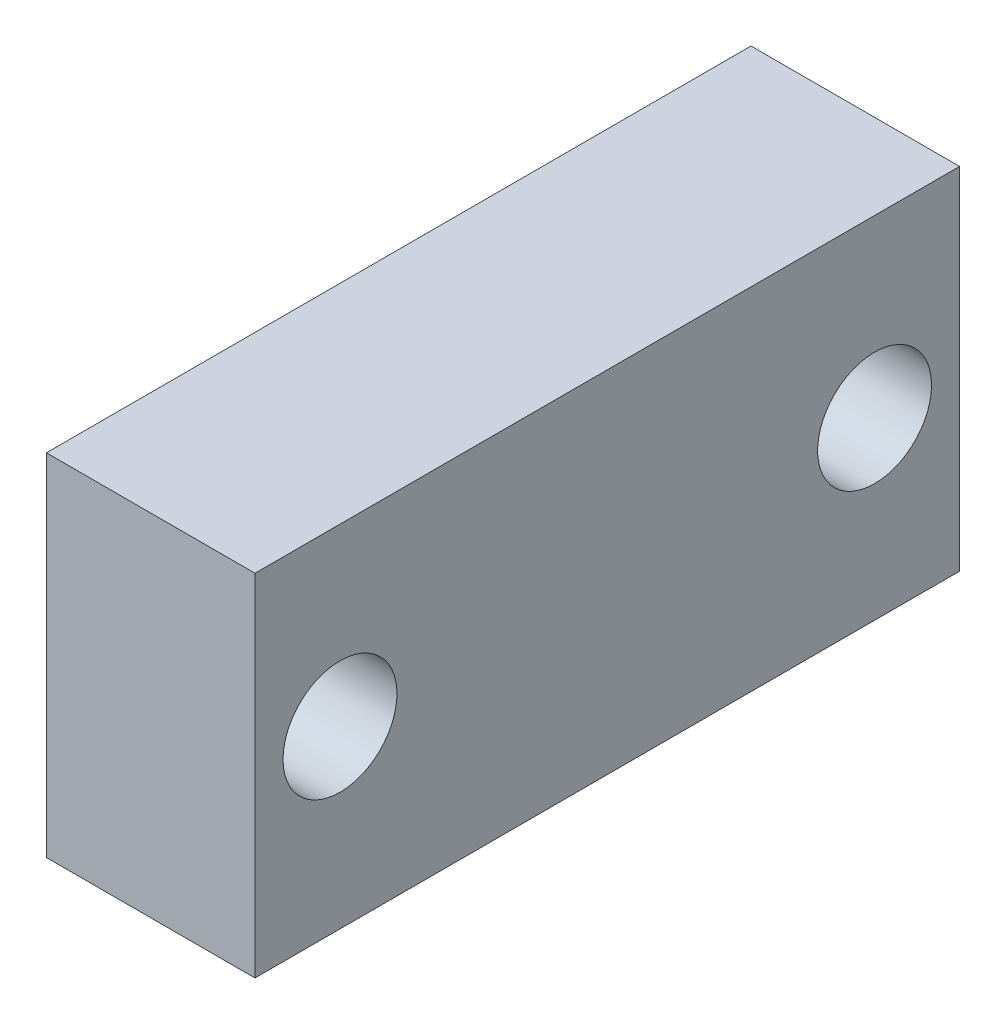
ISO-10303-21;
HEADER;
FILE_DESCRIPTION(('STEP AP214'),'2;1');
FILE_NAME('part.step','',(''),(''),'','','');
FILE_SCHEMA(('AUTOMOTIVE_DESIGN { 1 0 10303 214 1 1 1 1 }'));
ENDSEC;
DATA;
#1=APPLICATION_CONTEXT('core data for automotive mechanical design processes');
#2=APPLICATION_PROTOCOL_DEFINITION('international standard','automotive_design',2000,#1);
#3=PRODUCT_CONTEXT('',#1,'mechanical');
#4=PRODUCT('Part','Part','',(#3));
#5=PRODUCT_RELATED_PRODUCT_CATEGORY('part','',(#4));
#6=PRODUCT_DEFINITION_FORMATION('','',#4);
#7=PRODUCT_DEFINITION_CONTEXT('part definition',#1,'design');
#8=PRODUCT_DEFINITION('design','',#6,#7);
#9=PRODUCT_DEFINITION_SHAPE('','',#8);
#10=(LENGTH_UNIT() NAMED_UNIT(*) SI_UNIT(.MILLI.,.METRE.));
#11=(NAMED_UNIT(*) PLANE_ANGLE_UNIT() SI_UNIT($,.RADIAN.));
#12=(NAMED_UNIT(*) SI_UNIT($,.STERADIAN.) SOLID_ANGLE_UNIT());
#13=UNCERTAINTY_MEASURE_WITH_UNIT(LENGTH_MEASURE(1.E-05),#10,'distance_accuracy_value','');
#14=(GEOMETRIC_REPRESENTATION_CONTEXT(3) GLOBAL_UNCERTAINTY_ASSIGNED_CONTEXT((#13)) GLOBAL_UNIT_ASSIGNED_CONTEXT((#10,
#11,#12)) REPRESENTATION_CONTEXT('',''));
#15=CARTESIAN_POINT('',(0.,0.,0.));
#16=DIRECTION('',(0.,0.,1.));
#17=DIRECTION('',(1.,0.,0.));
#18=AXIS2_PLACEMENT_3D('',#15,#16,#17);
#19=CARTESIAN_POINT('',(11.9,0.,0.));
#20=DIRECTION('',(1.,0.,0.));
#21=DIRECTION('',(0.,0.,-1.));
#22=AXIS2_PLACEMENT_3D('',#19,#20,#21);
#23=PLANE('',#22);
#24=DIRECTION('',(0.,1.,0.));
#25=VECTOR('',#24,1.);
#26=CARTESIAN_POINT('',(11.9,10.,-20.1));
#27=LINE('',#26,#25);
#28=CARTESIAN_POINT('',(11.9,-10.,-20.1));
#29=VERTEX_POINT('',#28);
#30=CARTESIAN_POINT('',(11.9,10.,-20.1));
#31=VERTEX_POINT('',#30);
#32=EDGE_CURVE('E94',#29,#31,#27,.T.);
#33=ORIENTED_EDGE('',*,*,#32,.T.);
#34=DIRECTION('',(0.,0.,1.));
#35=VECTOR('',#34,1.);
#36=CARTESIAN_POINT('',(11.9,10.,20.1));
#37=LINE('',#36,#35);
#38=CARTESIAN_POINT('',(11.9,10.,20.1));
#39=VERTEX_POINT('',#38);
#40=EDGE_CURVE('E89',#31,#39,#37,.T.);
#41=ORIENTED_EDGE('',*,*,#40,.T.);
#42=DIRECTION('',(0.,-1.,0.));
#43=VECTOR('',#42,1.);
#44=CARTESIAN_POINT('',(11.9,10.,20.1));
#45=LINE('',#44,#43);
#46=CARTESIAN_POINT('',(11.9,-10.,20.1));
#47=VERTEX_POINT('',#46);
#48=EDGE_CURVE('E92',#39,#47,#45,.T.);
#49=ORIENTED_EDGE('',*,*,#48,.T.);
#50=DIRECTION('',(0.,0.,-1.));
#51=VECTOR('',#50,1.);
#52=CARTESIAN_POINT('',(11.9,-10.,20.1));
#53=LINE('',#52,#51);
#54=EDGE_CURVE('E58',#47,#29,#53,.T.);
#55=ORIENTED_EDGE('',*,*,#54,.T.);
#56=EDGE_LOOP('',(#33,#41,#49,#55));
#57=FACE_BOUND('',#56,.T.);
#58=CARTESIAN_POINT('',(11.9,0.,15.25));
#59=DIRECTION('',(-1.,0.,0.));
#60=DIRECTION('',(0.,0.,1.));
#61=AXIS2_PLACEMENT_3D('',#58,#59,#60);
#62=CIRCLE('',#61,3.25);
#63=CARTESIAN_POINT('',(11.9,0.,18.5));
#64=VERTEX_POINT('',#63);
#65=EDGE_CURVE('E165',#64,#64,#62,.T.);
#66=ORIENTED_EDGE('',*,*,#65,.T.);
#67=EDGE_LOOP('',(#66));
#68=FACE_BOUND('',#67,.T.);
#69=CARTESIAN_POINT('',(11.9,0.,-15.25));
#70=DIRECTION('',(1.,0.,0.));
#71=DIRECTION('',(0.,0.,-1.));
#72=AXIS2_PLACEMENT_3D('',#69,#70,#71);
#73=CIRCLE('',#72,3.25);
#74=CARTESIAN_POINT('',(11.9,0.,-18.5));
#75=VERTEX_POINT('',#74);
#76=EDGE_CURVE('E168',#75,#75,#73,.T.);
#77=ORIENTED_EDGE('',*,*,#76,.F.);
#78=EDGE_LOOP('',(#77));
#79=FACE_BOUND('',#78,.T.);
#80=ADVANCED_FACE('F40',(#57,#68,#79),#23,.T.);
#81=CARTESIAN_POINT('',(0.,0.,-15.25));
#82=DIRECTION('',(1.,0.,0.));
#83=DIRECTION('',(0.,0.,-1.));
#84=AXIS2_PLACEMENT_3D('',#81,#82,#83);
#85=CYLINDRICAL_SURFACE('',#84,2.);
#86=CARTESIAN_POINT('',(0.,0.,-15.25));
#87=DIRECTION('',(1.,0.,0.));
#88=DIRECTION('',(0.,0.,-1.));
#89=AXIS2_PLACEMENT_3D('',#86,#87,#88);
#90=CIRCLE('',#89,2.);
#91=CARTESIAN_POINT('',(0.,0.,-17.25));
#92=VERTEX_POINT('',#91);
#93=EDGE_CURVE('E153',#92,#92,#90,.T.);
#94=ORIENTED_EDGE('',*,*,#93,.F.);
#95=EDGE_LOOP('',(#94));
#96=FACE_BOUND('',#95,.T.);
#97=CARTESIAN_POINT('',(2.9,0.,-15.25));
#98=DIRECTION('',(1.,0.,0.));
#99=DIRECTION('',(0.,0.,-1.));
#100=AXIS2_PLACEMENT_3D('',#97,#98,#99);
#101=CIRCLE('',#100,2.);
#102=CARTESIAN_POINT('',(2.9,0.,-17.25));
#103=VERTEX_POINT('',#102);
#104=EDGE_CURVE('E120',#103,#103,#101,.F.);
#105=ORIENTED_EDGE('',*,*,#104,.F.);
#106=EDGE_LOOP('',(#105));
#107=FACE_BOUND('',#106,.T.);
#108=ADVANCED_FACE('F185',(#96,#107),#85,.F.);
#109=CARTESIAN_POINT('',(0.,0.,0.));
#110=DIRECTION('',(1.,0.,0.));
#111=DIRECTION('',(0.,0.,-1.));
#112=AXIS2_PLACEMENT_3D('',#109,#110,#111);
#113=PLANE('',#112);
#114=DIRECTION('',(0.,1.,0.));
#115=VECTOR('',#114,1.);
#116=CARTESIAN_POINT('',(0.,10.,-20.1));
#117=LINE('',#116,#115);
#118=CARTESIAN_POINT('',(0.,-10.,-20.1));
#119=VERTEX_POINT('',#118);
#120=CARTESIAN_POINT('',(0.,10.,-20.1));
#121=VERTEX_POINT('',#120);
#122=EDGE_CURVE('E109',#119,#121,#117,.T.);
#123=ORIENTED_EDGE('',*,*,#122,.F.);
#124=DIRECTION('',(0.,0.,-1.));
#125=VECTOR('',#124,1.);
#126=CARTESIAN_POINT('',(0.,-10.,20.1));
#127=LINE('',#126,#125);
#128=CARTESIAN_POINT('',(0.,-10.,20.1));
#129=VERTEX_POINT('',#128);
#130=EDGE_CURVE('E81',#129,#119,#127,.T.);
#131=ORIENTED_EDGE('',*,*,#130,.F.);
#132=DIRECTION('',(0.,-1.,0.));
#133=VECTOR('',#132,1.);
#134=CARTESIAN_POINT('',(0.,10.,20.1));
#135=LINE('',#134,#133);
#136=CARTESIAN_POINT('',(0.,10.,20.1));
#137=VERTEX_POINT('',#136);
#138=EDGE_CURVE('E75',#137,#129,#135,.T.);
#139=ORIENTED_EDGE('',*,*,#138,.F.);
#140=DIRECTION('',(0.,0.,1.));
#141=VECTOR('',#140,1.);
#142=CARTESIAN_POINT('',(0.,10.,20.1));
#143=LINE('',#142,#141);
#144=EDGE_CURVE('E99',#121,#137,#143,.T.);
#145=ORIENTED_EDGE('',*,*,#144,.F.);
#146=EDGE_LOOP('',(#123,#131,#139,#145));
#147=FACE_BOUND('',#146,.T.);
#148=CARTESIAN_POINT('',(0.,0.,15.25));
#149=DIRECTION('',(-1.,0.,0.));
#150=DIRECTION('',(0.,0.,1.));
#151=AXIS2_PLACEMENT_3D('',#148,#149,#150);
#152=CIRCLE('',#151,2.);
#153=CARTESIAN_POINT('',(0.,0.,17.25));
#154=VERTEX_POINT('',#153);
#155=EDGE_CURVE('E127',#154,#154,#152,.T.);
#156=ORIENTED_EDGE('',*,*,#155,.F.);
#157=EDGE_LOOP('',(#156));
#158=FACE_BOUND('',#157,.T.);
#159=ORIENTED_EDGE('',*,*,#93,.T.);
#160=EDGE_LOOP('',(#159));
#161=FACE_BOUND('',#160,.T.);
#162=ADVANCED_FACE('F190',(#147,#158,#161),#113,.F.);
#163=CARTESIAN_POINT('',(11.9,10.,-20.1));
#164=DIRECTION('',(0.,0.,1.));
#165=DIRECTION('',(0.,-1.,0.));
#166=AXIS2_PLACEMENT_3D('',#163,#164,#165);
#167=PLANE('',#166);
#168=ORIENTED_EDGE('',*,*,#122,.T.);
#169=DIRECTION('',(-1.,0.,0.));
#170=VECTOR('',#169,1.);
#171=CARTESIAN_POINT('',(11.9,10.,-20.1));
#172=LINE('',#171,#170);
#173=EDGE_CURVE('E100',#31,#121,#172,.T.);
#174=ORIENTED_EDGE('',*,*,#173,.F.);
#175=ORIENTED_EDGE('',*,*,#32,.F.);
#176=DIRECTION('',(-1.,0.,0.));
#177=VECTOR('',#176,1.);
#178=CARTESIAN_POINT('',(11.9,-10.,-20.1));
#179=LINE('',#178,#177);
#180=EDGE_CURVE('E105',#29,#119,#179,.T.);
#181=ORIENTED_EDGE('',*,*,#180,.T.);
#182=EDGE_LOOP('',(#168,#174,#175,#181));
#183=FACE_BOUND('',#182,.T.);
#184=ADVANCED_FACE('F197',(#183),#167,.F.);
#185=CARTESIAN_POINT('',(11.9,10.,20.1));
#186=DIRECTION('',(0.,-1.,0.));
#187=DIRECTION('',(0.,0.,-1.));
#188=AXIS2_PLACEMENT_3D('',#185,#186,#187);
#189=PLANE('',#188);
#190=ORIENTED_EDGE('',*,*,#144,.T.);
#191=DIRECTION('',(-1.,0.,0.));
#192=VECTOR('',#191,1.);
#193=CARTESIAN_POINT('',(11.9,10.,20.1));
#194=LINE('',#193,#192);
#195=EDGE_CURVE('E97',#39,#137,#194,.T.);
#196=ORIENTED_EDGE('',*,*,#195,.F.);
#197=ORIENTED_EDGE('',*,*,#40,.F.);
#198=ORIENTED_EDGE('',*,*,#173,.T.);
#199=EDGE_LOOP('',(#190,#196,#197,#198));
#200=FACE_BOUND('',#199,.T.);
#201=ADVANCED_FACE('F98',(#200),#189,.F.);
#202=CARTESIAN_POINT('',(11.9,10.,20.1));
#203=DIRECTION('',(0.,0.,-1.));
#204=DIRECTION('',(0.,1.,0.));
#205=AXIS2_PLACEMENT_3D('',#202,#203,#204);
#206=PLANE('',#205);
#207=ORIENTED_EDGE('',*,*,#138,.T.);
#208=DIRECTION('',(-1.,0.,0.));
#209=VECTOR('',#208,1.);
#210=CARTESIAN_POINT('',(11.9,-10.,20.1));
#211=LINE('',#210,#209);
#212=EDGE_CURVE('E101',#47,#129,#211,.T.);
#213=ORIENTED_EDGE('',*,*,#212,.F.);
#214=ORIENTED_EDGE('',*,*,#48,.F.);
#215=ORIENTED_EDGE('',*,*,#195,.T.);
#216=EDGE_LOOP('',(#207,#213,#214,#215));
#217=FACE_BOUND('',#216,.T.);
#218=ADVANCED_FACE('F103',(#217),#206,.F.);
#219=CARTESIAN_POINT('',(11.9,-10.,20.1));
#220=DIRECTION('',(0.,1.,0.));
#221=DIRECTION('',(0.,0.,1.));
#222=AXIS2_PLACEMENT_3D('',#219,#220,#221);
#223=PLANE('',#222);
#224=CARTESIAN_POINT('',(3.89,-10.,4.9));
#225=DIRECTION('',(0.,1.,0.));
#226=DIRECTION('',(0.,0.,1.));
#227=AXIS2_PLACEMENT_3D('',#224,#225,#226);
#228=CIRCLE('',#227,3.35000000000001);
#229=CARTESIAN_POINT('',(3.89,-10.,8.25000000000001));
#230=VERTEX_POINT('',#229);
#231=EDGE_CURVE('E50',#230,#230,#228,.T.);
#232=ORIENTED_EDGE('',*,*,#231,.T.);
#233=EDGE_LOOP('',(#232));
#234=FACE_BOUND('',#233,.T.);
#235=CARTESIAN_POINT('',(3.89,-10.,-4.9));
#236=DIRECTION('',(0.,1.,0.));
#237=DIRECTION('',(0.,0.,1.));
#238=AXIS2_PLACEMENT_3D('',#235,#236,#237);
#239=CIRCLE('',#238,3.35);
#240=CARTESIAN_POINT('',(3.89,-10.,-1.55));
#241=VERTEX_POINT('',#240);
#242=EDGE_CURVE('E130',#241,#241,#239,.T.);
#243=ORIENTED_EDGE('',*,*,#242,.T.);
#244=EDGE_LOOP('',(#243));
#245=FACE_BOUND('',#244,.T.);
#246=ORIENTED_EDGE('',*,*,#130,.T.);
#247=ORIENTED_EDGE('',*,*,#180,.F.);
#248=ORIENTED_EDGE('',*,*,#54,.F.);
#249=ORIENTED_EDGE('',*,*,#212,.T.);
#250=EDGE_LOOP('',(#246,#247,#248,#249));
#251=FACE_BOUND('',#250,.T.);
#252=ADVANCED_FACE('F135',(#234,#245,#251),#223,.F.);
#253=CARTESIAN_POINT('',(3.89,0.,4.9));
#254=DIRECTION('',(0.,-1.,0.));
#255=DIRECTION('',(0.,0.,-1.));
#256=AXIS2_PLACEMENT_3D('',#253,#254,#255);
#257=CYLINDRICAL_SURFACE('',#256,2.35);
#258=CARTESIAN_POINT('',(3.89,-8.99999999999999,4.9));
#259=DIRECTION('',(0.,1.,0.));
#260=DIRECTION('',(0.,0.,1.));
#261=AXIS2_PLACEMENT_3D('',#258,#259,#260);
#262=CIRCLE('',#261,2.35);
#263=CARTESIAN_POINT('',(3.89,-8.99999999999999,7.25));
#264=VERTEX_POINT('',#263);
#265=EDGE_CURVE('E119',#264,#264,#262,.F.);
#266=ORIENTED_EDGE('',*,*,#265,.T.);
#267=EDGE_LOOP('',(#266));
#268=FACE_BOUND('',#267,.T.);
#269=CARTESIAN_POINT('',(3.89,0.,4.9));
#270=DIRECTION('',(0.,-1.,0.));
#271=DIRECTION('',(0.,0.,1.));
#272=AXIS2_PLACEMENT_3D('',#269,#270,#271);
#273=CIRCLE('',#272,2.35);
#274=CARTESIAN_POINT('',(3.89,0.,7.25));
#275=VERTEX_POINT('',#274);
#276=EDGE_CURVE('E151',#275,#275,#273,.T.);
#277=ORIENTED_EDGE('',*,*,#276,.F.);
#278=EDGE_LOOP('',(#277));
#279=FACE_BOUND('',#278,.T.);
#280=ADVANCED_FACE('F144',(#268,#279),#257,.F.);
#281=CARTESIAN_POINT('',(3.89,0.,4.9));
#282=DIRECTION('',(0.,1.,0.));
#283=DIRECTION('',(0.,0.,1.));
#284=AXIS2_PLACEMENT_3D('',#281,#282,#283);
#285=PLANE('',#284);
#286=ORIENTED_EDGE('',*,*,#276,.T.);
#287=EDGE_LOOP('',(#286));
#288=FACE_BOUND('',#287,.T.);
#289=ADVANCED_FACE('F147',(#288),#285,.F.);
#290=CARTESIAN_POINT('',(3.89,0.,-4.9));
#291=DIRECTION('',(0.,-1.,0.));
#292=DIRECTION('',(0.,0.,-1.));
#293=AXIS2_PLACEMENT_3D('',#290,#291,#292);
#294=CYLINDRICAL_SURFACE('',#293,2.35);
#295=CARTESIAN_POINT('',(3.89,-9.,-4.9));
#296=DIRECTION('',(0.,1.,0.));
#297=DIRECTION('',(0.,0.,1.));
#298=AXIS2_PLACEMENT_3D('',#295,#296,#297);
#299=CIRCLE('',#298,2.35);
#300=CARTESIAN_POINT('',(3.89,-9.,-2.55));
#301=VERTEX_POINT('',#300);
#302=EDGE_CURVE('E11',#301,#301,#299,.F.);
#303=ORIENTED_EDGE('',*,*,#302,.T.);
#304=EDGE_LOOP('',(#303));
#305=FACE_BOUND('',#304,.T.);
#306=CARTESIAN_POINT('',(3.89,0.,-4.9));
#307=DIRECTION('',(0.,-1.,0.));
#308=DIRECTION('',(0.,0.,-1.));
#309=AXIS2_PLACEMENT_3D('',#306,#307,#308);
#310=CIRCLE('',#309,2.35);
#311=CARTESIAN_POINT('',(3.89,0.,-7.25));
#312=VERTEX_POINT('',#311);
#313=EDGE_CURVE('E112',#312,#312,#310,.T.);
#314=ORIENTED_EDGE('',*,*,#313,.F.);
#315=EDGE_LOOP('',(#314));
#316=FACE_BOUND('',#315,.T.);
#317=ADVANCED_FACE('F239',(#305,#316),#294,.F.);
#318=CARTESIAN_POINT('',(3.89,0.,-4.9));
#319=DIRECTION('',(0.,-1.,0.));
#320=DIRECTION('',(0.,0.,-1.));
#321=AXIS2_PLACEMENT_3D('',#318,#319,#320);
#322=PLANE('',#321);
#323=ORIENTED_EDGE('',*,*,#313,.T.);
#324=EDGE_LOOP('',(#323));
#325=FACE_BOUND('',#324,.T.);
#326=ADVANCED_FACE('F227',(#325),#322,.T.);
#327=CARTESIAN_POINT('',(0.,0.,15.25));
#328=DIRECTION('',(1.,0.,0.));
#329=DIRECTION('',(0.,0.,-1.));
#330=AXIS2_PLACEMENT_3D('',#327,#328,#329);
#331=CYLINDRICAL_SURFACE('',#330,2.);
#332=CARTESIAN_POINT('',(2.9,0.,15.25));
#333=DIRECTION('',(-1.,0.,0.));
#334=DIRECTION('',(0.,0.,1.));
#335=AXIS2_PLACEMENT_3D('',#332,#333,#334);
#336=CIRCLE('',#335,2.);
#337=CARTESIAN_POINT('',(2.9,0.,17.25));
#338=VERTEX_POINT('',#337);
#339=EDGE_CURVE('E123',#338,#338,#336,.T.);
#340=ORIENTED_EDGE('',*,*,#339,.F.);
#341=EDGE_LOOP('',(#340));
#342=FACE_BOUND('',#341,.T.);
#343=ORIENTED_EDGE('',*,*,#155,.T.);
#344=EDGE_LOOP('',(#343));
#345=FACE_BOUND('',#344,.T.);
#346=ADVANCED_FACE('F222',(#342,#345),#331,.F.);
#347=CARTESIAN_POINT('',(2.9,0.,-15.25));
#348=DIRECTION('',(1.,0.,0.));
#349=DIRECTION('',(0.,0.,-1.));
#350=AXIS2_PLACEMENT_3D('',#347,#348,#349);
#351=PLANE('',#350);
#352=CARTESIAN_POINT('',(2.9,0.,-15.25));
#353=DIRECTION('',(1.,0.,0.));
#354=DIRECTION('',(0.,0.,-1.));
#355=AXIS2_PLACEMENT_3D('',#352,#353,#354);
#356=CIRCLE('',#355,3.25);
#357=CARTESIAN_POINT('',(2.9,0.,-18.5));
#358=VERTEX_POINT('',#357);
#359=EDGE_CURVE('E124',#358,#358,#356,.T.);
#360=ORIENTED_EDGE('',*,*,#359,.T.);
#361=EDGE_LOOP('',(#360));
#362=FACE_BOUND('',#361,.T.);
#363=ORIENTED_EDGE('',*,*,#104,.T.);
#364=EDGE_LOOP('',(#363));
#365=FACE_BOUND('',#364,.T.);
#366=ADVANCED_FACE('F174',(#362,#365),#351,.T.);
#367=CARTESIAN_POINT('',(2.9,0.,-15.25));
#368=DIRECTION('',(1.,0.,0.));
#369=DIRECTION('',(0.,0.,-1.));
#370=AXIS2_PLACEMENT_3D('',#367,#368,#369);
#371=CYLINDRICAL_SURFACE('',#370,3.25);
#372=ORIENTED_EDGE('',*,*,#359,.F.);
#373=EDGE_LOOP('',(#372));
#374=FACE_BOUND('',#373,.T.);
#375=ORIENTED_EDGE('',*,*,#76,.T.);
#376=EDGE_LOOP('',(#375));
#377=FACE_BOUND('',#376,.T.);
#378=ADVANCED_FACE('F177',(#374,#377),#371,.F.);
#379=CARTESIAN_POINT('',(2.9,0.,15.25));
#380=DIRECTION('',(1.,0.,0.));
#381=DIRECTION('',(0.,0.,-1.));
#382=AXIS2_PLACEMENT_3D('',#379,#380,#381);
#383=CYLINDRICAL_SURFACE('',#382,3.25);
#384=CARTESIAN_POINT('',(2.9,0.,15.25));
#385=DIRECTION('',(-1.,0.,0.));
#386=DIRECTION('',(0.,0.,1.));
#387=AXIS2_PLACEMENT_3D('',#384,#385,#386);
#388=CIRCLE('',#387,3.25);
#389=CARTESIAN_POINT('',(2.9,0.,18.5));
#390=VERTEX_POINT('',#389);
#391=EDGE_CURVE('E162',#390,#390,#388,.T.);
#392=ORIENTED_EDGE('',*,*,#391,.T.);
#393=EDGE_LOOP('',(#392));
#394=FACE_BOUND('',#393,.T.);
#395=ORIENTED_EDGE('',*,*,#65,.F.);
#396=EDGE_LOOP('',(#395));
#397=FACE_BOUND('',#396,.T.);
#398=ADVANCED_FACE('F180',(#394,#397),#383,.F.);
#399=CARTESIAN_POINT('',(2.9,0.,15.25));
#400=DIRECTION('',(-1.,0.,0.));
#401=DIRECTION('',(0.,0.,1.));
#402=AXIS2_PLACEMENT_3D('',#399,#400,#401);
#403=PLANE('',#402);
#404=ORIENTED_EDGE('',*,*,#339,.T.);
#405=EDGE_LOOP('',(#404));
#406=FACE_BOUND('',#405,.T.);
#407=ORIENTED_EDGE('',*,*,#391,.F.);
#408=EDGE_LOOP('',(#407));
#409=FACE_BOUND('',#408,.T.);
#410=ADVANCED_FACE('F141',(#406,#409),#403,.F.);
#411=CARTESIAN_POINT('',(3.89,-8.99999999999999,4.9));
#412=DIRECTION('',(0.,-1.,0.));
#413=DIRECTION('',(0.,0.,-1.));
#414=AXIS2_PLACEMENT_3D('',#411,#412,#413);
#415=CONICAL_SURFACE('',#414,2.35,0.785398163397451);
#416=ORIENTED_EDGE('',*,*,#231,.F.);
#417=EDGE_LOOP('',(#416));
#418=FACE_BOUND('',#417,.T.);
#419=ORIENTED_EDGE('',*,*,#265,.F.);
#420=EDGE_LOOP('',(#419));
#421=FACE_BOUND('',#420,.T.);
#422=ADVANCED_FACE('F138',(#418,#421),#415,.F.);
#423=CARTESIAN_POINT('',(3.89,-9.,-4.9));
#424=DIRECTION('',(0.,-1.,0.));
#425=DIRECTION('',(0.,0.,-1.));
#426=AXIS2_PLACEMENT_3D('',#423,#424,#425);
#427=CONICAL_SURFACE('',#426,2.35,0.785398163397448);
#428=ORIENTED_EDGE('',*,*,#242,.F.);
#429=EDGE_LOOP('',(#428));
#430=FACE_BOUND('',#429,.T.);
#431=ORIENTED_EDGE('',*,*,#302,.F.);
#432=EDGE_LOOP('',(#431));
#433=FACE_BOUND('',#432,.T.);
#434=ADVANCED_FACE('F43',(#430,#433),#427,.F.);
#435=CLOSED_SHELL('',(#80,#108,#162,#184,#201,#218,#252,#280,#289,#317,#326,#346,#366,#378,#398,
#410,#422,#434));
#436=MANIFOLD_SOLID_BREP('B2',#435);
#437=ADVANCED_BREP_SHAPE_REPRESENTATION('',(#18,#436),#14);
#438=SHAPE_DEFINITION_REPRESENTATION(#9,#437);
ENDSEC;
END-ISO-10303-21;
